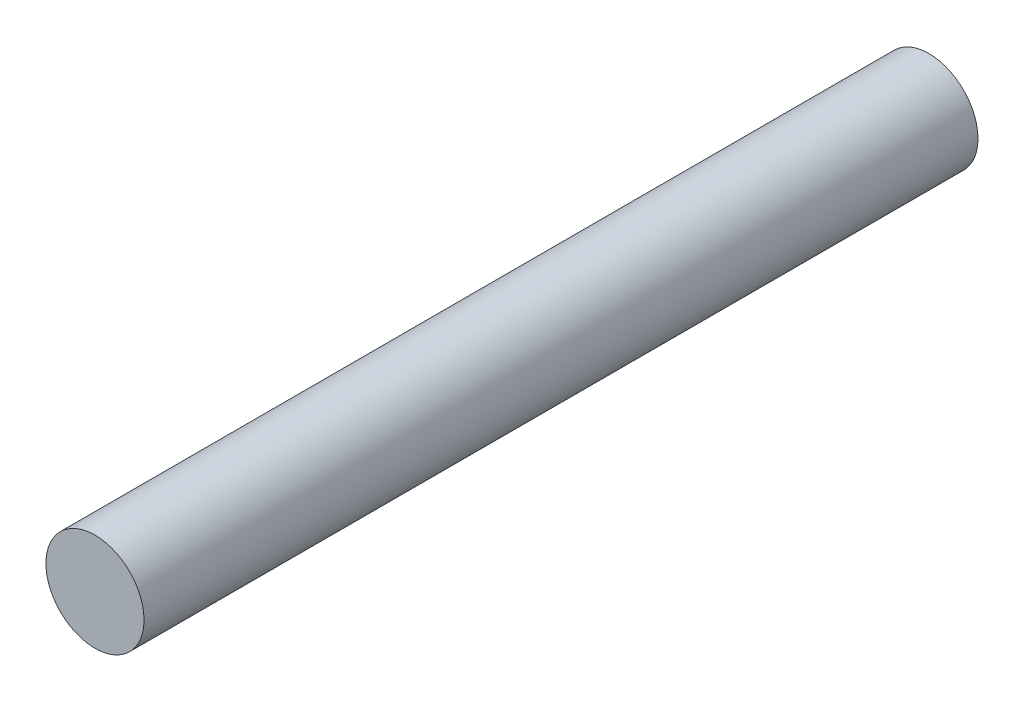
ISO-10303-21;
HEADER;
FILE_DESCRIPTION(('STEP AP214'),'2;1');
FILE_NAME('part.step','',(''),(''),'','','');
FILE_SCHEMA(('AUTOMOTIVE_DESIGN { 1 0 10303 214 1 1 1 1 }'));
ENDSEC;
DATA;
#1=APPLICATION_CONTEXT('core data for automotive mechanical design processes');
#2=APPLICATION_PROTOCOL_DEFINITION('international standard','automotive_design',2000,#1);
#3=PRODUCT_CONTEXT('',#1,'mechanical');
#4=PRODUCT('Part','Part','',(#3));
#5=PRODUCT_RELATED_PRODUCT_CATEGORY('part','',(#4));
#6=PRODUCT_DEFINITION_FORMATION('','',#4);
#7=PRODUCT_DEFINITION_CONTEXT('part definition',#1,'design');
#8=PRODUCT_DEFINITION('design','',#6,#7);
#9=PRODUCT_DEFINITION_SHAPE('','',#8);
#10=(LENGTH_UNIT() NAMED_UNIT(*) SI_UNIT(.MILLI.,.METRE.));
#11=(NAMED_UNIT(*) PLANE_ANGLE_UNIT() SI_UNIT($,.RADIAN.));
#12=(NAMED_UNIT(*) SI_UNIT($,.STERADIAN.) SOLID_ANGLE_UNIT());
#13=UNCERTAINTY_MEASURE_WITH_UNIT(LENGTH_MEASURE(1.E-05),#10,'distance_accuracy_value','');
#14=(GEOMETRIC_REPRESENTATION_CONTEXT(3) GLOBAL_UNCERTAINTY_ASSIGNED_CONTEXT((#13)) GLOBAL_UNIT_ASSIGNED_CONTEXT((#10,
#11,#12)) REPRESENTATION_CONTEXT('',''));
#15=CARTESIAN_POINT('',(0.,0.,0.));
#16=DIRECTION('',(0.,0.,1.));
#17=DIRECTION('',(1.,0.,0.));
#18=AXIS2_PLACEMENT_3D('',#15,#16,#17);
#19=CARTESIAN_POINT('',(0.,0.,68.));
#20=DIRECTION('',(0.,0.,-1.));
#21=DIRECTION('',(-1.,0.,0.));
#22=AXIS2_PLACEMENT_3D('',#19,#20,#21);
#23=CYLINDRICAL_SURFACE('',#22,4.);
#24=CARTESIAN_POINT('',(0.,0.,68.));
#25=DIRECTION('',(0.,0.,1.));
#26=DIRECTION('',(1.,0.,0.));
#27=AXIS2_PLACEMENT_3D('',#24,#25,#26);
#28=CIRCLE('',#27,4.);
#29=CARTESIAN_POINT('',(4.,0.,68.));
#30=VERTEX_POINT('',#29);
#31=EDGE_CURVE('E10',#30,#30,#28,.T.);
#32=ORIENTED_EDGE('',*,*,#31,.F.);
#33=EDGE_LOOP('',(#32));
#34=FACE_BOUND('',#33,.T.);
#35=CARTESIAN_POINT('',(0.,0.,0.));
#36=DIRECTION('',(0.,0.,1.));
#37=DIRECTION('',(1.,0.,0.));
#38=AXIS2_PLACEMENT_3D('',#35,#36,#37);
#39=CIRCLE('',#38,4.);
#40=CARTESIAN_POINT('',(4.,0.,0.));
#41=VERTEX_POINT('',#40);
#42=EDGE_CURVE('E40',#41,#41,#39,.T.);
#43=ORIENTED_EDGE('',*,*,#42,.T.);
#44=EDGE_LOOP('',(#43));
#45=FACE_BOUND('',#44,.T.);
#46=ADVANCED_FACE('F37',(#34,#45),#23,.T.);
#47=CARTESIAN_POINT('',(0.,0.,68.));
#48=DIRECTION('',(0.,0.,1.));
#49=DIRECTION('',(1.,0.,0.));
#50=AXIS2_PLACEMENT_3D('',#47,#48,#49);
#51=PLANE('',#50);
#52=ORIENTED_EDGE('',*,*,#31,.T.);
#53=EDGE_LOOP('',(#52));
#54=FACE_BOUND('',#53,.T.);
#55=ADVANCED_FACE('F54',(#54),#51,.T.);
#56=CARTESIAN_POINT('',(0.,0.,0.));
#57=DIRECTION('',(0.,0.,1.));
#58=DIRECTION('',(1.,0.,0.));
#59=AXIS2_PLACEMENT_3D('',#56,#57,#58);
#60=PLANE('',#59);
#61=ORIENTED_EDGE('',*,*,#42,.F.);
#62=EDGE_LOOP('',(#61));
#63=FACE_BOUND('',#62,.T.);
#64=ADVANCED_FACE('F52',(#63),#60,.F.);
#65=CLOSED_SHELL('',(#46,#55,#64));
#66=MANIFOLD_SOLID_BREP('B2',#65);
#67=ADVANCED_BREP_SHAPE_REPRESENTATION('',(#18,#66),#14);
#68=SHAPE_DEFINITION_REPRESENTATION(#9,#67);
ENDSEC;
END-ISO-10303-21;
